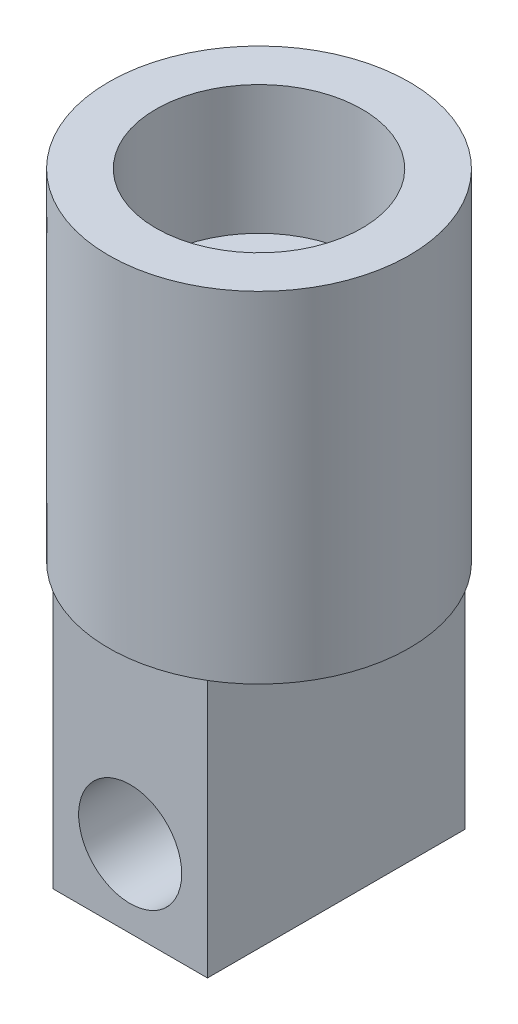
ISO-10303-21;
HEADER;
FILE_DESCRIPTION(('STEP AP214'),'2;1');
FILE_NAME('part.step','',(''),(''),'','','');
FILE_SCHEMA(('AUTOMOTIVE_DESIGN { 1 0 10303 214 1 1 1 1 }'));
ENDSEC;
DATA;
#1=APPLICATION_CONTEXT('core data for automotive mechanical design processes');
#2=APPLICATION_PROTOCOL_DEFINITION('international standard','automotive_design',2000,#1);
#3=PRODUCT_CONTEXT('',#1,'mechanical');
#4=PRODUCT('Part','Part','',(#3));
#5=PRODUCT_RELATED_PRODUCT_CATEGORY('part','',(#4));
#6=PRODUCT_DEFINITION_FORMATION('','',#4);
#7=PRODUCT_DEFINITION_CONTEXT('part definition',#1,'design');
#8=PRODUCT_DEFINITION('design','',#6,#7);
#9=PRODUCT_DEFINITION_SHAPE('','',#8);
#10=(LENGTH_UNIT() NAMED_UNIT(*) SI_UNIT(.MILLI.,.METRE.));
#11=(NAMED_UNIT(*) PLANE_ANGLE_UNIT() SI_UNIT($,.RADIAN.));
#12=(NAMED_UNIT(*) SI_UNIT($,.STERADIAN.) SOLID_ANGLE_UNIT());
#13=UNCERTAINTY_MEASURE_WITH_UNIT(LENGTH_MEASURE(1.E-05),#10,'distance_accuracy_value','');
#14=(GEOMETRIC_REPRESENTATION_CONTEXT(3) GLOBAL_UNCERTAINTY_ASSIGNED_CONTEXT((#13)) GLOBAL_UNIT_ASSIGNED_CONTEXT((#10,
#11,#12)) REPRESENTATION_CONTEXT('',''));
#15=CARTESIAN_POINT('',(0.,0.,0.));
#16=DIRECTION('',(0.,0.,1.));
#17=DIRECTION('',(1.,0.,0.));
#18=AXIS2_PLACEMENT_3D('',#15,#16,#17);
#19=CARTESIAN_POINT('',(0.,0.,50.));
#20=DIRECTION('',(0.,0.,-1.));
#21=DIRECTION('',(-1.,0.,0.));
#22=AXIS2_PLACEMENT_3D('',#19,#20,#21);
#23=PLANE('',#22);
#24=DIRECTION('',(0.,-1.,0.));
#25=VECTOR('',#24,1.);
#26=CARTESIAN_POINT('',(-308.597239890848,-55.,50.));
#27=LINE('',#26,#25);
#28=CARTESIAN_POINT('',(-308.597239890848,-5.00000000000004,50.));
#29=VERTEX_POINT('',#28);
#30=CARTESIAN_POINT('',(-308.597239890848,-55.,50.));
#31=VERTEX_POINT('',#30);
#32=EDGE_CURVE('E89',#29,#31,#27,.T.);
#33=ORIENTED_EDGE('',*,*,#32,.T.);
#34=DIRECTION('',(1.,0.,0.));
#35=VECTOR('',#34,1.);
#36=CARTESIAN_POINT('',(-308.597239890848,-55.,50.));
#37=LINE('',#36,#35);
#38=CARTESIAN_POINT('',(-278.597239890848,-55.,50.));
#39=VERTEX_POINT('',#38);
#40=EDGE_CURVE('E74',#31,#39,#37,.T.);
#41=ORIENTED_EDGE('',*,*,#40,.T.);
#42=DIRECTION('',(0.,1.,0.));
#43=VECTOR('',#42,1.);
#44=CARTESIAN_POINT('',(-278.597239890848,-55.,50.));
#45=LINE('',#44,#43);
#46=CARTESIAN_POINT('',(-278.597239890848,-5.00000000000004,50.));
#47=VERTEX_POINT('',#46);
#48=EDGE_CURVE('E171',#39,#47,#45,.T.);
#49=ORIENTED_EDGE('',*,*,#48,.T.);
#50=DIRECTION('',(-1.,0.,0.));
#51=VECTOR('',#50,1.);
#52=CARTESIAN_POINT('',(-308.597239890848,-5.00000000000004,50.));
#53=LINE('',#52,#51);
#54=EDGE_CURVE('E49',#47,#29,#53,.T.);
#55=ORIENTED_EDGE('',*,*,#54,.T.);
#56=EDGE_LOOP('',(#33,#41,#49,#55));
#57=FACE_BOUND('',#56,.T.);
#58=CARTESIAN_POINT('',(-293.597239890848,-39.9999999999999,50.));
#59=DIRECTION('',(0.,0.,1.));
#60=DIRECTION('',(1.,0.,0.));
#61=AXIS2_PLACEMENT_3D('',#58,#59,#60);
#62=CIRCLE('',#61,9.99999999999998);
#63=CARTESIAN_POINT('',(-283.597239890848,-39.9999999999999,50.));
#64=VERTEX_POINT('',#63);
#65=EDGE_CURVE('E164',#64,#64,#62,.T.);
#66=ORIENTED_EDGE('',*,*,#65,.F.);
#67=EDGE_LOOP('',(#66));
#68=FACE_BOUND('',#67,.T.);
#69=ADVANCED_FACE('F32',(#57,#68),#23,.F.);
#70=CARTESIAN_POINT('',(0.,0.,0.));
#71=DIRECTION('',(0.,0.,-1.));
#72=DIRECTION('',(-1.,0.,0.));
#73=AXIS2_PLACEMENT_3D('',#70,#71,#72);
#74=PLANE('',#73);
#75=DIRECTION('',(0.,-1.,0.));
#76=VECTOR('',#75,1.);
#77=CARTESIAN_POINT('',(-308.597239890848,-55.,0.));
#78=LINE('',#77,#76);
#79=CARTESIAN_POINT('',(-308.597239890848,-5.00000000000004,0.));
#80=VERTEX_POINT('',#79);
#81=CARTESIAN_POINT('',(-308.597239890848,-55.,0.));
#82=VERTEX_POINT('',#81);
#83=EDGE_CURVE('E85',#80,#82,#78,.T.);
#84=ORIENTED_EDGE('',*,*,#83,.F.);
#85=DIRECTION('',(-1.,0.,0.));
#86=VECTOR('',#85,1.);
#87=CARTESIAN_POINT('',(-308.597239890848,-5.00000000000004,0.));
#88=LINE('',#87,#86);
#89=CARTESIAN_POINT('',(-278.597239890848,-5.00000000000004,0.));
#90=VERTEX_POINT('',#89);
#91=EDGE_CURVE('E80',#90,#80,#88,.T.);
#92=ORIENTED_EDGE('',*,*,#91,.F.);
#93=DIRECTION('',(0.,1.,0.));
#94=VECTOR('',#93,1.);
#95=CARTESIAN_POINT('',(-278.597239890848,-55.,0.));
#96=LINE('',#95,#94);
#97=CARTESIAN_POINT('',(-278.597239890848,-55.,0.));
#98=VERTEX_POINT('',#97);
#99=EDGE_CURVE('E84',#98,#90,#96,.T.);
#100=ORIENTED_EDGE('',*,*,#99,.F.);
#101=DIRECTION('',(1.,0.,0.));
#102=VECTOR('',#101,1.);
#103=CARTESIAN_POINT('',(-308.597239890848,-55.,0.));
#104=LINE('',#103,#102);
#105=EDGE_CURVE('E62',#82,#98,#104,.T.);
#106=ORIENTED_EDGE('',*,*,#105,.F.);
#107=EDGE_LOOP('',(#84,#92,#100,#106));
#108=FACE_BOUND('',#107,.T.);
#109=CARTESIAN_POINT('',(-293.597239890848,-39.9999999999999,0.));
#110=DIRECTION('',(0.,0.,1.));
#111=DIRECTION('',(1.,0.,0.));
#112=AXIS2_PLACEMENT_3D('',#109,#110,#111);
#113=CIRCLE('',#112,9.99999999999998);
#114=CARTESIAN_POINT('',(-283.597239890848,-39.9999999999999,0.));
#115=VERTEX_POINT('',#114);
#116=EDGE_CURVE('E117',#115,#115,#113,.T.);
#117=ORIENTED_EDGE('',*,*,#116,.T.);
#118=EDGE_LOOP('',(#117));
#119=FACE_BOUND('',#118,.T.);
#120=ADVANCED_FACE('F82',(#108,#119),#74,.T.);
#121=CARTESIAN_POINT('',(-308.597239890848,-55.,50.));
#122=DIRECTION('',(1.,0.,0.));
#123=DIRECTION('',(0.,1.,0.));
#124=AXIS2_PLACEMENT_3D('',#121,#122,#123);
#125=PLANE('',#124);
#126=ORIENTED_EDGE('',*,*,#83,.T.);
#127=DIRECTION('',(0.,0.,-1.));
#128=VECTOR('',#127,1.);
#129=CARTESIAN_POINT('',(-308.597239890848,-55.,50.));
#130=LINE('',#129,#128);
#131=EDGE_CURVE('E11',#31,#82,#130,.T.);
#132=ORIENTED_EDGE('',*,*,#131,.F.);
#133=ORIENTED_EDGE('',*,*,#32,.F.);
#134=DIRECTION('',(0.,0.,-1.));
#135=VECTOR('',#134,1.);
#136=CARTESIAN_POINT('',(-308.597239890848,-5.00000000000004,50.));
#137=LINE('',#136,#135);
#138=EDGE_CURVE('E69',#29,#80,#137,.T.);
#139=ORIENTED_EDGE('',*,*,#138,.T.);
#140=EDGE_LOOP('',(#126,#132,#133,#139));
#141=FACE_BOUND('',#140,.T.);
#142=ADVANCED_FACE('F34',(#141),#125,.F.);
#143=CARTESIAN_POINT('',(-308.597239890848,-55.,50.));
#144=DIRECTION('',(0.,1.,0.));
#145=DIRECTION('',(0.,0.,1.));
#146=AXIS2_PLACEMENT_3D('',#143,#144,#145);
#147=PLANE('',#146);
#148=ORIENTED_EDGE('',*,*,#105,.T.);
#149=DIRECTION('',(0.,0.,-1.));
#150=VECTOR('',#149,1.);
#151=CARTESIAN_POINT('',(-278.597239890848,-55.,50.));
#152=LINE('',#151,#150);
#153=EDGE_CURVE('E41',#39,#98,#152,.T.);
#154=ORIENTED_EDGE('',*,*,#153,.F.);
#155=ORIENTED_EDGE('',*,*,#40,.F.);
#156=ORIENTED_EDGE('',*,*,#131,.T.);
#157=EDGE_LOOP('',(#148,#154,#155,#156));
#158=FACE_BOUND('',#157,.T.);
#159=ADVANCED_FACE('F156',(#158),#147,.F.);
#160=CARTESIAN_POINT('',(-278.597239890848,-55.,50.));
#161=DIRECTION('',(-1.,0.,0.));
#162=DIRECTION('',(0.,0.,1.));
#163=AXIS2_PLACEMENT_3D('',#160,#161,#162);
#164=PLANE('',#163);
#165=ORIENTED_EDGE('',*,*,#99,.T.);
#166=DIRECTION('',(0.,0.,-1.));
#167=VECTOR('',#166,1.);
#168=CARTESIAN_POINT('',(-278.597239890848,-5.00000000000004,50.));
#169=LINE('',#168,#167);
#170=EDGE_CURVE('E96',#47,#90,#169,.T.);
#171=ORIENTED_EDGE('',*,*,#170,.F.);
#172=ORIENTED_EDGE('',*,*,#48,.F.);
#173=ORIENTED_EDGE('',*,*,#153,.T.);
#174=EDGE_LOOP('',(#165,#171,#172,#173));
#175=FACE_BOUND('',#174,.T.);
#176=ADVANCED_FACE('F94',(#175),#164,.F.);
#177=CARTESIAN_POINT('',(-293.597239890848,-39.9999999999999,50.));
#178=DIRECTION('',(0.,0.,-1.));
#179=DIRECTION('',(-1.,0.,0.));
#180=AXIS2_PLACEMENT_3D('',#177,#178,#179);
#181=CYLINDRICAL_SURFACE('',#180,9.99999999999998);
#182=ORIENTED_EDGE('',*,*,#65,.T.);
#183=EDGE_LOOP('',(#182));
#184=FACE_BOUND('',#183,.T.);
#185=ORIENTED_EDGE('',*,*,#116,.F.);
#186=EDGE_LOOP('',(#185));
#187=FACE_BOUND('',#186,.T.);
#188=ADVANCED_FACE('F153',(#184,#187),#181,.F.);
#189=CARTESIAN_POINT('',(-293.597239890848,-5.00000000000004,25.));
#190=DIRECTION('',(0.,1.,0.));
#191=DIRECTION('',(0.,0.,1.));
#192=AXIS2_PLACEMENT_3D('',#189,#190,#191);
#193=PLANE('',#192);
#194=ORIENTED_EDGE('',*,*,#138,.F.);
#195=CARTESIAN_POINT('',(-293.597239890848,-5.00000000000004,25.));
#196=DIRECTION('',(0.,1.,0.));
#197=DIRECTION('',(0.,0.,1.));
#198=AXIS2_PLACEMENT_3D('',#195,#196,#197);
#199=CIRCLE('',#198,29.1547594742265);
#200=EDGE_CURVE('E109',#80,#29,#199,.T.);
#201=ORIENTED_EDGE('',*,*,#200,.F.);
#202=EDGE_LOOP('',(#194,#201));
#203=FACE_BOUND('',#202,.T.);
#204=ADVANCED_FACE('F179',(#203),#193,.F.);
#205=ORIENTED_EDGE('',*,*,#54,.F.);
#206=EDGE_CURVE('E114',#29,#47,#199,.T.);
#207=ORIENTED_EDGE('',*,*,#206,.F.);
#208=EDGE_LOOP('',(#205,#207));
#209=FACE_BOUND('',#208,.T.);
#210=ADVANCED_FACE('F143',(#209),#193,.F.);
#211=EDGE_CURVE('E105',#90,#80,#199,.T.);
#212=ORIENTED_EDGE('',*,*,#211,.F.);
#213=ORIENTED_EDGE('',*,*,#91,.T.);
#214=EDGE_LOOP('',(#212,#213));
#215=FACE_BOUND('',#214,.T.);
#216=ADVANCED_FACE('F106',(#215),#193,.F.);
#217=CARTESIAN_POINT('',(-293.597239890848,60.9999999999999,25.));
#218=DIRECTION('',(0.,-1.,0.));
#219=DIRECTION('',(0.,0.,-1.));
#220=AXIS2_PLACEMENT_3D('',#217,#218,#219);
#221=CYLINDRICAL_SURFACE('',#220,29.1547594742265);
#222=CARTESIAN_POINT('',(-293.597239890848,60.9999999999999,25.));
#223=DIRECTION('',(0.,1.,0.));
#224=DIRECTION('',(0.,0.,1.));
#225=AXIS2_PLACEMENT_3D('',#222,#223,#224);
#226=CIRCLE('',#225,29.1547594742265);
#227=CARTESIAN_POINT('',(-293.597239890848,60.9999999999999,54.1547594742265));
#228=VERTEX_POINT('',#227);
#229=EDGE_CURVE('E115',#228,#228,#226,.T.);
#230=ORIENTED_EDGE('',*,*,#229,.F.);
#231=EDGE_LOOP('',(#230));
#232=FACE_BOUND('',#231,.T.);
#233=EDGE_CURVE('E102',#47,#90,#199,.T.);
#234=ORIENTED_EDGE('',*,*,#233,.T.);
#235=ORIENTED_EDGE('',*,*,#211,.T.);
#236=ORIENTED_EDGE('',*,*,#200,.T.);
#237=ORIENTED_EDGE('',*,*,#206,.T.);
#238=EDGE_LOOP('',(#234,#235,#236,#237));
#239=FACE_BOUND('',#238,.T.);
#240=ADVANCED_FACE('F112',(#232,#239),#221,.T.);
#241=CARTESIAN_POINT('',(-293.597239890848,60.9999999999999,25.));
#242=DIRECTION('',(0.,1.,0.));
#243=DIRECTION('',(0.,0.,1.));
#244=AXIS2_PLACEMENT_3D('',#241,#242,#243);
#245=PLANE('',#244);
#246=CARTESIAN_POINT('',(-293.597239890848,60.9999999999999,25.));
#247=DIRECTION('',(0.,1.,0.));
#248=DIRECTION('',(0.,0.,1.));
#249=AXIS2_PLACEMENT_3D('',#246,#247,#248);
#250=CIRCLE('',#249,20.);
#251=CARTESIAN_POINT('',(-293.597239890848,60.9999999999999,45.));
#252=VERTEX_POINT('',#251);
#253=EDGE_CURVE('E122',#252,#252,#250,.T.);
#254=ORIENTED_EDGE('',*,*,#253,.F.);
#255=EDGE_LOOP('',(#254));
#256=FACE_BOUND('',#255,.T.);
#257=ORIENTED_EDGE('',*,*,#229,.T.);
#258=EDGE_LOOP('',(#257));
#259=FACE_BOUND('',#258,.T.);
#260=ADVANCED_FACE('F132',(#256,#259),#245,.T.);
#261=ORIENTED_EDGE('',*,*,#233,.F.);
#262=ORIENTED_EDGE('',*,*,#170,.T.);
#263=EDGE_LOOP('',(#261,#262));
#264=FACE_BOUND('',#263,.T.);
#265=ADVANCED_FACE('F100',(#264),#193,.F.);
#266=CARTESIAN_POINT('',(-293.597239890848,35.9999999999999,25.));
#267=DIRECTION('',(0.,1.,0.));
#268=DIRECTION('',(0.,0.,1.));
#269=AXIS2_PLACEMENT_3D('',#266,#267,#268);
#270=CYLINDRICAL_SURFACE('',#269,20.);
#271=CARTESIAN_POINT('',(-293.597239890848,35.9999999999999,25.));
#272=DIRECTION('',(0.,1.,0.));
#273=DIRECTION('',(0.,0.,1.));
#274=AXIS2_PLACEMENT_3D('',#271,#272,#273);
#275=CIRCLE('',#274,20.);
#276=CARTESIAN_POINT('',(-293.597239890848,35.9999999999999,45.));
#277=VERTEX_POINT('',#276);
#278=EDGE_CURVE('E120',#277,#277,#275,.T.);
#279=ORIENTED_EDGE('',*,*,#278,.F.);
#280=EDGE_LOOP('',(#279));
#281=FACE_BOUND('',#280,.T.);
#282=ORIENTED_EDGE('',*,*,#253,.T.);
#283=EDGE_LOOP('',(#282));
#284=FACE_BOUND('',#283,.T.);
#285=ADVANCED_FACE('F130',(#281,#284),#270,.F.);
#286=CARTESIAN_POINT('',(-293.597239890848,35.9999999999999,25.));
#287=DIRECTION('',(0.,1.,0.));
#288=DIRECTION('',(0.,0.,1.));
#289=AXIS2_PLACEMENT_3D('',#286,#287,#288);
#290=PLANE('',#289);
#291=ORIENTED_EDGE('',*,*,#278,.T.);
#292=EDGE_LOOP('',(#291));
#293=FACE_BOUND('',#292,.T.);
#294=ADVANCED_FACE('F194',(#293),#290,.T.);
#295=CLOSED_SHELL('',(#69,#120,#142,#159,#176,#188,#204,#210,#216,#240,#260,#265,#285,#294));
#296=MANIFOLD_SOLID_BREP('B2',#295);
#297=ADVANCED_BREP_SHAPE_REPRESENTATION('',(#18,#296),#14);
#298=SHAPE_DEFINITION_REPRESENTATION(#9,#297);
ENDSEC;
END-ISO-10303-21;
